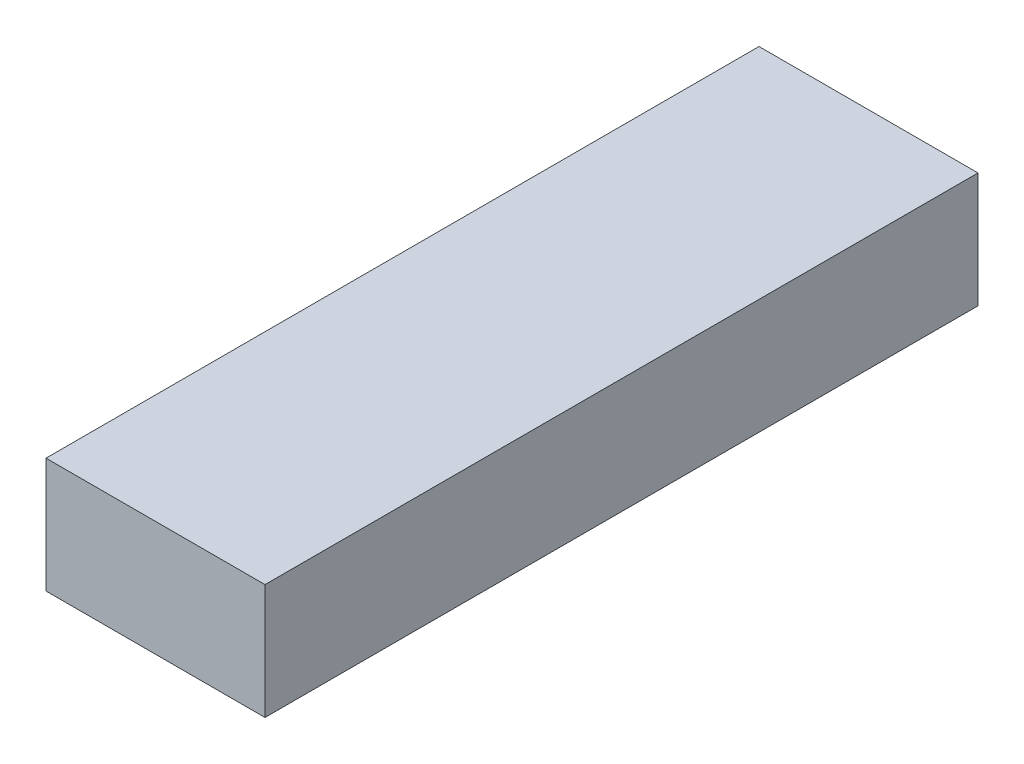
ISO-10303-21;
HEADER;
FILE_DESCRIPTION(('STEP AP214'),'2;1');
FILE_NAME('part.step','',(''),(''),'','','');
FILE_SCHEMA(('AUTOMOTIVE_DESIGN { 1 0 10303 214 1 1 1 1 }'));
ENDSEC;
DATA;
#1=APPLICATION_CONTEXT('core data for automotive mechanical design processes');
#2=APPLICATION_PROTOCOL_DEFINITION('international standard','automotive_design',2000,#1);
#3=PRODUCT_CONTEXT('',#1,'mechanical');
#4=PRODUCT('Part','Part','',(#3));
#5=PRODUCT_RELATED_PRODUCT_CATEGORY('part','',(#4));
#6=PRODUCT_DEFINITION_FORMATION('','',#4);
#7=PRODUCT_DEFINITION_CONTEXT('part definition',#1,'design');
#8=PRODUCT_DEFINITION('design','',#6,#7);
#9=PRODUCT_DEFINITION_SHAPE('','',#8);
#10=(LENGTH_UNIT() NAMED_UNIT(*) SI_UNIT(.MILLI.,.METRE.));
#11=(NAMED_UNIT(*) PLANE_ANGLE_UNIT() SI_UNIT($,.RADIAN.));
#12=(NAMED_UNIT(*) SI_UNIT($,.STERADIAN.) SOLID_ANGLE_UNIT());
#13=UNCERTAINTY_MEASURE_WITH_UNIT(LENGTH_MEASURE(1.E-05),#10,'distance_accuracy_value','');
#14=(GEOMETRIC_REPRESENTATION_CONTEXT(3) GLOBAL_UNCERTAINTY_ASSIGNED_CONTEXT((#13)) GLOBAL_UNIT_ASSIGNED_CONTEXT((#10,
#11,#12)) REPRESENTATION_CONTEXT('',''));
#15=CARTESIAN_POINT('',(0.,0.,0.));
#16=DIRECTION('',(0.,0.,1.));
#17=DIRECTION('',(1.,0.,0.));
#18=AXIS2_PLACEMENT_3D('',#15,#16,#17);
#19=CARTESIAN_POINT('',(21.5,22.6,70.));
#20=DIRECTION('',(-1.,0.,0.));
#21=DIRECTION('',(0.,0.,1.));
#22=AXIS2_PLACEMENT_3D('',#19,#20,#21);
#23=PLANE('',#22);
#24=DIRECTION('',(0.,0.,-1.));
#25=VECTOR('',#24,1.);
#26=CARTESIAN_POINT('',(21.5,0.,70.));
#27=LINE('',#26,#25);
#28=CARTESIAN_POINT('',(21.5,0.,70.));
#29=VERTEX_POINT('',#28);
#30=CARTESIAN_POINT('',(21.5,0.,-70.));
#31=VERTEX_POINT('',#30);
#32=EDGE_CURVE('E102',#29,#31,#27,.T.);
#33=ORIENTED_EDGE('',*,*,#32,.T.);
#34=DIRECTION('',(0.,-1.,0.));
#35=VECTOR('',#34,1.);
#36=CARTESIAN_POINT('',(21.5,22.6,-70.));
#37=LINE('',#36,#35);
#38=CARTESIAN_POINT('',(21.5,22.6,-70.));
#39=VERTEX_POINT('',#38);
#40=EDGE_CURVE('E11',#39,#31,#37,.T.);
#41=ORIENTED_EDGE('',*,*,#40,.F.);
#42=DIRECTION('',(0.,0.,-1.));
#43=VECTOR('',#42,1.);
#44=CARTESIAN_POINT('',(21.5,22.6,70.));
#45=LINE('',#44,#43);
#46=CARTESIAN_POINT('',(21.5,22.6,70.));
#47=VERTEX_POINT('',#46);
#48=EDGE_CURVE('E90',#47,#39,#45,.T.);
#49=ORIENTED_EDGE('',*,*,#48,.F.);
#50=DIRECTION('',(0.,-1.,0.));
#51=VECTOR('',#50,1.);
#52=CARTESIAN_POINT('',(21.5,22.6,70.));
#53=LINE('',#52,#51);
#54=EDGE_CURVE('E98',#47,#29,#53,.T.);
#55=ORIENTED_EDGE('',*,*,#54,.T.);
#56=EDGE_LOOP('',(#33,#41,#49,#55));
#57=FACE_BOUND('',#56,.T.);
#58=ADVANCED_FACE('F39',(#57),#23,.F.);
#59=CARTESIAN_POINT('',(-21.5,22.6,-70.));
#60=DIRECTION('',(0.,0.,1.));
#61=DIRECTION('',(1.,0.,0.));
#62=AXIS2_PLACEMENT_3D('',#59,#60,#61);
#63=PLANE('',#62);
#64=DIRECTION('',(-1.,0.,0.));
#65=VECTOR('',#64,1.);
#66=CARTESIAN_POINT('',(-21.5,0.,-70.));
#67=LINE('',#66,#65);
#68=CARTESIAN_POINT('',(-21.5,0.,-70.));
#69=VERTEX_POINT('',#68);
#70=EDGE_CURVE('E94',#31,#69,#67,.T.);
#71=ORIENTED_EDGE('',*,*,#70,.T.);
#72=DIRECTION('',(0.,-1.,0.));
#73=VECTOR('',#72,1.);
#74=CARTESIAN_POINT('',(-21.5,22.6,-70.));
#75=LINE('',#74,#73);
#76=CARTESIAN_POINT('',(-21.5,22.6,-70.));
#77=VERTEX_POINT('',#76);
#78=EDGE_CURVE('E47',#77,#69,#75,.T.);
#79=ORIENTED_EDGE('',*,*,#78,.F.);
#80=DIRECTION('',(-1.,0.,0.));
#81=VECTOR('',#80,1.);
#82=CARTESIAN_POINT('',(-21.5,22.6,-70.));
#83=LINE('',#82,#81);
#84=EDGE_CURVE('E85',#39,#77,#83,.T.);
#85=ORIENTED_EDGE('',*,*,#84,.F.);
#86=ORIENTED_EDGE('',*,*,#40,.T.);
#87=EDGE_LOOP('',(#71,#79,#85,#86));
#88=FACE_BOUND('',#87,.T.);
#89=ADVANCED_FACE('F93',(#88),#63,.F.);
#90=CARTESIAN_POINT('',(-21.5,22.6,70.));
#91=DIRECTION('',(1.,0.,0.));
#92=DIRECTION('',(0.,0.,-1.));
#93=AXIS2_PLACEMENT_3D('',#90,#91,#92);
#94=PLANE('',#93);
#95=DIRECTION('',(0.,0.,1.));
#96=VECTOR('',#95,1.);
#97=CARTESIAN_POINT('',(-21.5,0.,70.));
#98=LINE('',#97,#96);
#99=CARTESIAN_POINT('',(-21.5,0.,70.));
#100=VERTEX_POINT('',#99);
#101=EDGE_CURVE('E72',#69,#100,#98,.T.);
#102=ORIENTED_EDGE('',*,*,#101,.T.);
#103=DIRECTION('',(0.,-1.,0.));
#104=VECTOR('',#103,1.);
#105=CARTESIAN_POINT('',(-21.5,22.6,70.));
#106=LINE('',#105,#104);
#107=CARTESIAN_POINT('',(-21.5,22.6,70.));
#108=VERTEX_POINT('',#107);
#109=EDGE_CURVE('E95',#108,#100,#106,.T.);
#110=ORIENTED_EDGE('',*,*,#109,.F.);
#111=DIRECTION('',(0.,0.,1.));
#112=VECTOR('',#111,1.);
#113=CARTESIAN_POINT('',(-21.5,22.6,70.));
#114=LINE('',#113,#112);
#115=EDGE_CURVE('E88',#77,#108,#114,.T.);
#116=ORIENTED_EDGE('',*,*,#115,.F.);
#117=ORIENTED_EDGE('',*,*,#78,.T.);
#118=EDGE_LOOP('',(#102,#110,#116,#117));
#119=FACE_BOUND('',#118,.T.);
#120=ADVANCED_FACE('F96',(#119),#94,.F.);
#121=CARTESIAN_POINT('',(-21.5,22.6,70.));
#122=DIRECTION('',(0.,0.,-1.));
#123=DIRECTION('',(-1.,0.,0.));
#124=AXIS2_PLACEMENT_3D('',#121,#122,#123);
#125=PLANE('',#124);
#126=DIRECTION('',(1.,0.,0.));
#127=VECTOR('',#126,1.);
#128=CARTESIAN_POINT('',(-21.5,0.,70.));
#129=LINE('',#128,#127);
#130=EDGE_CURVE('E78',#100,#29,#129,.T.);
#131=ORIENTED_EDGE('',*,*,#130,.T.);
#132=ORIENTED_EDGE('',*,*,#54,.F.);
#133=DIRECTION('',(1.,0.,0.));
#134=VECTOR('',#133,1.);
#135=CARTESIAN_POINT('',(-21.5,22.6,70.));
#136=LINE('',#135,#134);
#137=EDGE_CURVE('E55',#108,#47,#136,.T.);
#138=ORIENTED_EDGE('',*,*,#137,.F.);
#139=ORIENTED_EDGE('',*,*,#109,.T.);
#140=EDGE_LOOP('',(#131,#132,#138,#139));
#141=FACE_BOUND('',#140,.T.);
#142=ADVANCED_FACE('F109',(#141),#125,.F.);
#143=CARTESIAN_POINT('',(0.,22.6,0.));
#144=DIRECTION('',(0.,-1.,0.));
#145=DIRECTION('',(0.,0.,-1.));
#146=AXIS2_PLACEMENT_3D('',#143,#144,#145);
#147=PLANE('',#146);
#148=ORIENTED_EDGE('',*,*,#48,.T.);
#149=ORIENTED_EDGE('',*,*,#84,.T.);
#150=ORIENTED_EDGE('',*,*,#115,.T.);
#151=ORIENTED_EDGE('',*,*,#137,.T.);
#152=EDGE_LOOP('',(#148,#149,#150,#151));
#153=FACE_BOUND('',#152,.T.);
#154=ADVANCED_FACE('F86',(#153),#147,.F.);
#155=CARTESIAN_POINT('',(0.,0.,0.));
#156=DIRECTION('',(0.,-1.,0.));
#157=DIRECTION('',(0.,0.,-1.));
#158=AXIS2_PLACEMENT_3D('',#155,#156,#157);
#159=PLANE('',#158);
#160=ORIENTED_EDGE('',*,*,#32,.F.);
#161=ORIENTED_EDGE('',*,*,#130,.F.);
#162=ORIENTED_EDGE('',*,*,#101,.F.);
#163=ORIENTED_EDGE('',*,*,#70,.F.);
#164=EDGE_LOOP('',(#160,#161,#162,#163));
#165=FACE_BOUND('',#164,.T.);
#166=ADVANCED_FACE('F112',(#165),#159,.T.);
#167=CLOSED_SHELL('',(#58,#89,#120,#142,#154,#166));
#168=MANIFOLD_SOLID_BREP('B2',#167);
#169=ADVANCED_BREP_SHAPE_REPRESENTATION('',(#18,#168),#14);
#170=SHAPE_DEFINITION_REPRESENTATION(#9,#169);
ENDSEC;
END-ISO-10303-21;
